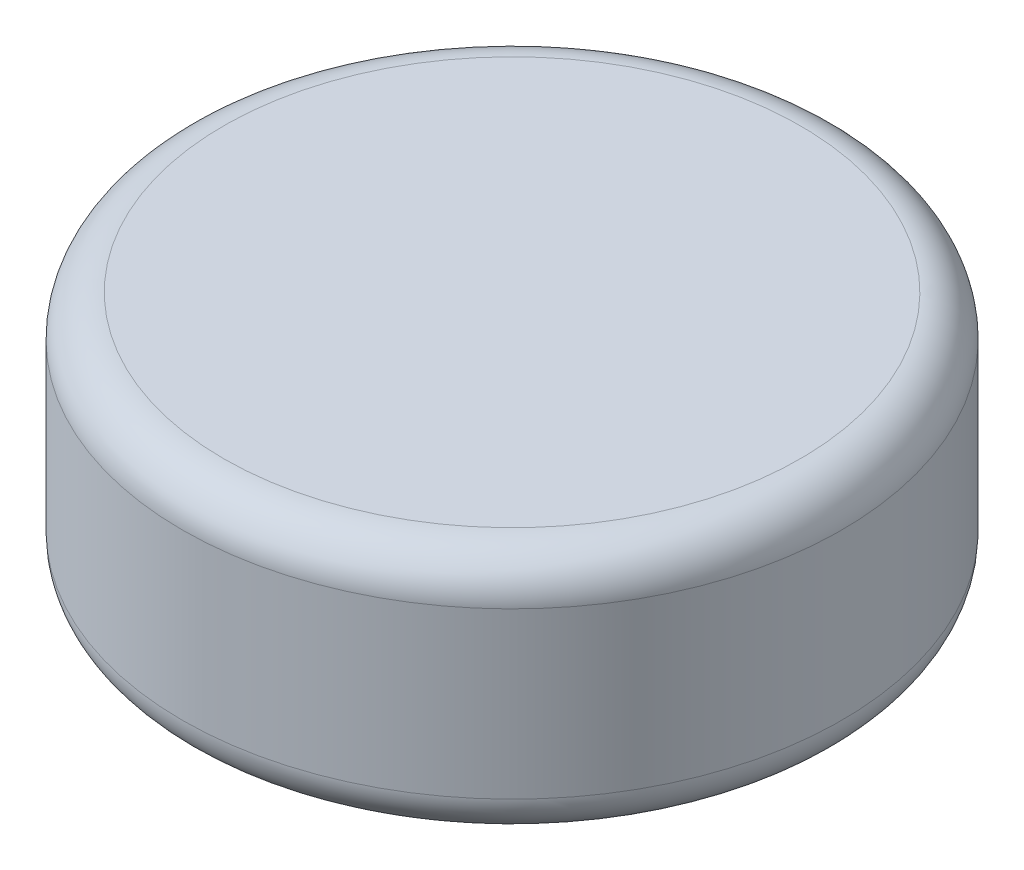
ISO-10303-21;
HEADER;
FILE_DESCRIPTION(('STEP AP214'),'2;1');
FILE_NAME('part.step','',(''),(''),'','','');
FILE_SCHEMA(('AUTOMOTIVE_DESIGN { 1 0 10303 214 1 1 1 1 }'));
ENDSEC;
DATA;
#1=APPLICATION_CONTEXT('core data for automotive mechanical design processes');
#2=APPLICATION_PROTOCOL_DEFINITION('international standard','automotive_design',2000,#1);
#3=PRODUCT_CONTEXT('',#1,'mechanical');
#4=PRODUCT('Part','Part','',(#3));
#5=PRODUCT_RELATED_PRODUCT_CATEGORY('part','',(#4));
#6=PRODUCT_DEFINITION_FORMATION('','',#4);
#7=PRODUCT_DEFINITION_CONTEXT('part definition',#1,'design');
#8=PRODUCT_DEFINITION('design','',#6,#7);
#9=PRODUCT_DEFINITION_SHAPE('','',#8);
#10=(LENGTH_UNIT() NAMED_UNIT(*) SI_UNIT(.MILLI.,.METRE.));
#11=(NAMED_UNIT(*) PLANE_ANGLE_UNIT() SI_UNIT($,.RADIAN.));
#12=(NAMED_UNIT(*) SI_UNIT($,.STERADIAN.) SOLID_ANGLE_UNIT());
#13=UNCERTAINTY_MEASURE_WITH_UNIT(LENGTH_MEASURE(1.E-05),#10,'distance_accuracy_value','');
#14=(GEOMETRIC_REPRESENTATION_CONTEXT(3) GLOBAL_UNCERTAINTY_ASSIGNED_CONTEXT((#13)) GLOBAL_UNIT_ASSIGNED_CONTEXT((#10,
#11,#12)) REPRESENTATION_CONTEXT('',''));
#15=CARTESIAN_POINT('',(0.,0.,0.));
#16=DIRECTION('',(0.,0.,1.));
#17=DIRECTION('',(1.,0.,0.));
#18=AXIS2_PLACEMENT_3D('',#15,#16,#17);
#19=CARTESIAN_POINT('',(0.,1.5,0.));
#20=DIRECTION('',(0.,-1.,0.));
#21=DIRECTION('',(0.,0.,-1.));
#22=AXIS2_PLACEMENT_3D('',#19,#20,#21);
#23=CYLINDRICAL_SURFACE('',#22,2.);
#24=CARTESIAN_POINT('',(0.,0.25,0.));
#25=DIRECTION('',(0.,1.,0.));
#26=DIRECTION('',(0.,0.,1.));
#27=AXIS2_PLACEMENT_3D('',#24,#25,#26);
#28=CIRCLE('',#27,2.);
#29=CARTESIAN_POINT('',(0.,0.25,2.));
#30=VERTEX_POINT('',#29);
#31=EDGE_CURVE('E44',#30,#30,#28,.T.);
#32=ORIENTED_EDGE('',*,*,#31,.T.);
#33=EDGE_LOOP('',(#32));
#34=FACE_BOUND('',#33,.T.);
#35=CARTESIAN_POINT('',(0.,1.25,0.));
#36=DIRECTION('',(0.,1.,0.));
#37=DIRECTION('',(0.,0.,1.));
#38=AXIS2_PLACEMENT_3D('',#35,#36,#37);
#39=CIRCLE('',#38,2.);
#40=CARTESIAN_POINT('',(0.,1.25,2.));
#41=VERTEX_POINT('',#40);
#42=EDGE_CURVE('E48',#41,#41,#39,.F.);
#43=ORIENTED_EDGE('',*,*,#42,.T.);
#44=EDGE_LOOP('',(#43));
#45=FACE_BOUND('',#44,.T.);
#46=ADVANCED_FACE('F33',(#34,#45),#23,.T.);
#47=CARTESIAN_POINT('',(0.,1.5,0.));
#48=DIRECTION('',(0.,1.,0.));
#49=DIRECTION('',(0.,0.,1.));
#50=AXIS2_PLACEMENT_3D('',#47,#48,#49);
#51=PLANE('',#50);
#52=CARTESIAN_POINT('',(0.,1.5,0.));
#53=DIRECTION('',(0.,1.,0.));
#54=DIRECTION('',(0.,0.,1.));
#55=AXIS2_PLACEMENT_3D('',#52,#53,#54);
#56=CIRCLE('',#55,1.75);
#57=CARTESIAN_POINT('',(0.,1.5,1.75));
#58=VERTEX_POINT('',#57);
#59=EDGE_CURVE('E10',#58,#58,#56,.T.);
#60=ORIENTED_EDGE('',*,*,#59,.T.);
#61=EDGE_LOOP('',(#60));
#62=FACE_BOUND('',#61,.T.);
#63=ADVANCED_FACE('F64',(#62),#51,.T.);
#64=CARTESIAN_POINT('',(0.,0.,0.));
#65=DIRECTION('',(0.,1.,0.));
#66=DIRECTION('',(0.,0.,1.));
#67=AXIS2_PLACEMENT_3D('',#64,#65,#66);
#68=PLANE('',#67);
#69=CARTESIAN_POINT('',(0.,0.,0.));
#70=DIRECTION('',(0.,1.,0.));
#71=DIRECTION('',(0.,0.,1.));
#72=AXIS2_PLACEMENT_3D('',#69,#70,#71);
#73=CIRCLE('',#72,1.75);
#74=CARTESIAN_POINT('',(0.,0.,1.75));
#75=VERTEX_POINT('',#74);
#76=EDGE_CURVE('E40',#75,#75,#73,.F.);
#77=ORIENTED_EDGE('',*,*,#76,.T.);
#78=EDGE_LOOP('',(#77));
#79=FACE_BOUND('',#78,.T.);
#80=ADVANCED_FACE('F61',(#79),#68,.F.);
#81=CARTESIAN_POINT('',(0.,0.25,0.));
#82=DIRECTION('',(0.,1.,0.));
#83=DIRECTION('',(0.,0.,1.));
#84=AXIS2_PLACEMENT_3D('',#81,#82,#83);
#85=TOROIDAL_SURFACE('',#84,1.75,0.25);
#86=ORIENTED_EDGE('',*,*,#76,.F.);
#87=EDGE_LOOP('',(#86));
#88=FACE_BOUND('',#87,.T.);
#89=ORIENTED_EDGE('',*,*,#31,.F.);
#90=EDGE_LOOP('',(#89));
#91=FACE_BOUND('',#90,.T.);
#92=ADVANCED_FACE('F57',(#88,#91),#85,.T.);
#93=CARTESIAN_POINT('',(0.,1.25,0.));
#94=DIRECTION('',(0.,1.,0.));
#95=DIRECTION('',(0.,0.,1.));
#96=AXIS2_PLACEMENT_3D('',#93,#94,#95);
#97=TOROIDAL_SURFACE('',#96,1.75,0.25);
#98=ORIENTED_EDGE('',*,*,#42,.F.);
#99=EDGE_LOOP('',(#98));
#100=FACE_BOUND('',#99,.T.);
#101=ORIENTED_EDGE('',*,*,#59,.F.);
#102=EDGE_LOOP('',(#101));
#103=FACE_BOUND('',#102,.T.);
#104=ADVANCED_FACE('F35',(#100,#103),#97,.T.);
#105=CLOSED_SHELL('',(#46,#63,#80,#92,#104));
#106=MANIFOLD_SOLID_BREP('B2',#105);
#107=ADVANCED_BREP_SHAPE_REPRESENTATION('',(#18,#106),#14);
#108=SHAPE_DEFINITION_REPRESENTATION(#9,#107);
ENDSEC;
END-ISO-10303-21;
